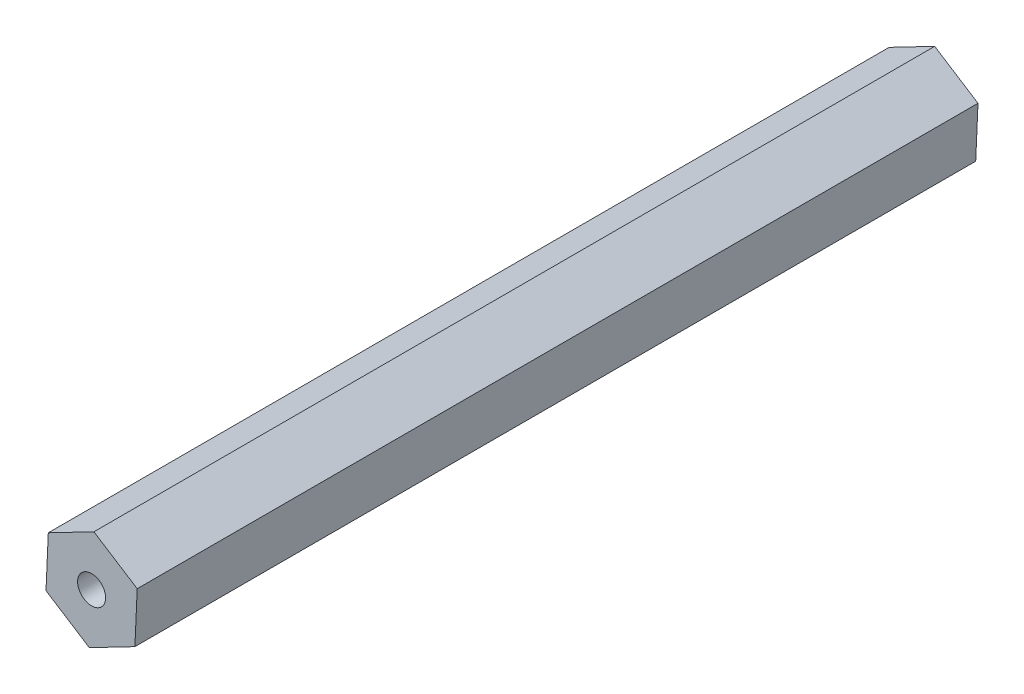
ISO-10303-21;
HEADER;
FILE_DESCRIPTION(('STEP AP214'),'2;1');
FILE_NAME('part.step','',(''),(''),'','','');
FILE_SCHEMA(('AUTOMOTIVE_DESIGN { 1 0 10303 214 1 1 1 1 }'));
ENDSEC;
DATA;
#1=APPLICATION_CONTEXT('core data for automotive mechanical design processes');
#2=APPLICATION_PROTOCOL_DEFINITION('international standard','automotive_design',2000,#1);
#3=PRODUCT_CONTEXT('',#1,'mechanical');
#4=PRODUCT('Part','Part','',(#3));
#5=PRODUCT_RELATED_PRODUCT_CATEGORY('part','',(#4));
#6=PRODUCT_DEFINITION_FORMATION('','',#4);
#7=PRODUCT_DEFINITION_CONTEXT('part definition',#1,'design');
#8=PRODUCT_DEFINITION('design','',#6,#7);
#9=PRODUCT_DEFINITION_SHAPE('','',#8);
#10=(LENGTH_UNIT() NAMED_UNIT(*) SI_UNIT(.MILLI.,.METRE.));
#11=(NAMED_UNIT(*) PLANE_ANGLE_UNIT() SI_UNIT($,.RADIAN.));
#12=(NAMED_UNIT(*) SI_UNIT($,.STERADIAN.) SOLID_ANGLE_UNIT());
#13=UNCERTAINTY_MEASURE_WITH_UNIT(LENGTH_MEASURE(1.E-05),#10,'distance_accuracy_value','');
#14=(GEOMETRIC_REPRESENTATION_CONTEXT(3) GLOBAL_UNCERTAINTY_ASSIGNED_CONTEXT((#13)) GLOBAL_UNIT_ASSIGNED_CONTEXT((#10,
#11,#12)) REPRESENTATION_CONTEXT('',''));
#15=CARTESIAN_POINT('',(0.,0.,0.));
#16=DIRECTION('',(0.,0.,1.));
#17=DIRECTION('',(1.,0.,0.));
#18=AXIS2_PLACEMENT_3D('',#15,#16,#17);
#19=CARTESIAN_POINT('',(-0.122915192994091,-2.74725169129645,45.));
#20=DIRECTION('',(-0.460792060365192,0.887508127908923,0.));
#21=DIRECTION('',(-0.887508127908923,-0.460792060365192,0.));
#22=AXIS2_PLACEMENT_3D('',#19,#20,#21);
#23=PLANE('',#22);
#24=DIRECTION('',(0.887508127908923,0.460792060365192,0.));
#25=VECTOR('',#24,1.);
#26=CARTESIAN_POINT('',(-0.122915192994091,-2.74725169129645,0.));
#27=LINE('',#26,#25);
#28=CARTESIAN_POINT('',(-0.122915192994091,-2.74725169129645,0.));
#29=VERTEX_POINT('',#28);
#30=CARTESIAN_POINT('',(2.31773215875545,-1.48007352529218,0.));
#31=VERTEX_POINT('',#30);
#32=EDGE_CURVE('E128',#29,#31,#27,.T.);
#33=ORIENTED_EDGE('',*,*,#32,.T.);
#34=DIRECTION('',(0.,0.,-1.));
#35=VECTOR('',#34,1.);
#36=CARTESIAN_POINT('',(2.31773215875545,-1.48007352529218,45.));
#37=LINE('',#36,#35);
#38=CARTESIAN_POINT('',(2.31773215875545,-1.48007352529218,45.));
#39=VERTEX_POINT('',#38);
#40=EDGE_CURVE('E11',#39,#31,#37,.T.);
#41=ORIENTED_EDGE('',*,*,#40,.F.);
#42=DIRECTION('',(0.887508127908923,0.460792060365192,0.));
#43=VECTOR('',#42,1.);
#44=CARTESIAN_POINT('',(-0.122915192994091,-2.74725169129645,45.));
#45=LINE('',#44,#43);
#46=CARTESIAN_POINT('',(-0.122915192994091,-2.74725169129645,45.));
#47=VERTEX_POINT('',#46);
#48=EDGE_CURVE('E145',#47,#39,#45,.T.);
#49=ORIENTED_EDGE('',*,*,#48,.F.);
#50=DIRECTION('',(0.,0.,-1.));
#51=VECTOR('',#50,1.);
#52=CARTESIAN_POINT('',(-0.122915192994091,-2.74725169129645,45.));
#53=LINE('',#52,#51);
#54=EDGE_CURVE('E124',#47,#29,#53,.T.);
#55=ORIENTED_EDGE('',*,*,#54,.T.);
#56=EDGE_LOOP('',(#33,#41,#49,#55));
#57=FACE_BOUND('',#56,.T.);
#58=ADVANCED_FACE('F39',(#57),#23,.F.);
#59=CARTESIAN_POINT('',(2.31773215875545,-1.48007352529218,45.));
#60=DIRECTION('',(-0.999000615016892,0.0446964338160327,0.));
#61=DIRECTION('',(-0.0446964338160327,-0.999000615016892,0.));
#62=AXIS2_PLACEMENT_3D('',#59,#60,#61);
#63=PLANE('',#62);
#64=DIRECTION('',(0.0446964338160327,0.999000615016892,0.));
#65=VECTOR('',#64,1.);
#66=CARTESIAN_POINT('',(2.31773215875545,-1.48007352529218,0.));
#67=LINE('',#66,#65);
#68=CARTESIAN_POINT('',(2.44064735174954,1.26717816600428,0.));
#69=VERTEX_POINT('',#68);
#70=EDGE_CURVE('E132',#31,#69,#67,.T.);
#71=ORIENTED_EDGE('',*,*,#70,.T.);
#72=DIRECTION('',(0.,0.,-1.));
#73=VECTOR('',#72,1.);
#74=CARTESIAN_POINT('',(2.44064735174954,1.26717816600428,45.));
#75=LINE('',#74,#73);
#76=CARTESIAN_POINT('',(2.44064735174954,1.26717816600428,45.));
#77=VERTEX_POINT('',#76);
#78=EDGE_CURVE('E48',#77,#69,#75,.T.);
#79=ORIENTED_EDGE('',*,*,#78,.F.);
#80=DIRECTION('',(0.0446964338160327,0.999000615016892,0.));
#81=VECTOR('',#80,1.);
#82=CARTESIAN_POINT('',(2.31773215875545,-1.48007352529218,45.));
#83=LINE('',#82,#81);
#84=EDGE_CURVE('E93',#39,#77,#83,.T.);
#85=ORIENTED_EDGE('',*,*,#84,.F.);
#86=ORIENTED_EDGE('',*,*,#40,.T.);
#87=EDGE_LOOP('',(#71,#79,#85,#86));
#88=FACE_BOUND('',#87,.T.);
#89=ADVANCED_FACE('F174',(#88),#63,.F.);
#90=CARTESIAN_POINT('',(2.44064735174954,1.26717816600428,45.));
#91=DIRECTION('',(-0.5382085546517,-0.84281169409289,0.));
#92=DIRECTION('',(0.84281169409289,-0.5382085546517,0.));
#93=AXIS2_PLACEMENT_3D('',#90,#91,#92);
#94=PLANE('',#93);
#95=DIRECTION('',(-0.84281169409289,0.5382085546517,0.));
#96=VECTOR('',#95,1.);
#97=CARTESIAN_POINT('',(2.44064735174954,1.26717816600428,0.));
#98=LINE('',#97,#96);
#99=CARTESIAN_POINT('',(0.12291519299409,2.74725169129645,0.));
#100=VERTEX_POINT('',#99);
#101=EDGE_CURVE('E136',#69,#100,#98,.T.);
#102=ORIENTED_EDGE('',*,*,#101,.T.);
#103=DIRECTION('',(0.,0.,-1.));
#104=VECTOR('',#103,1.);
#105=CARTESIAN_POINT('',(0.12291519299409,2.74725169129645,45.));
#106=LINE('',#105,#104);
#107=CARTESIAN_POINT('',(0.12291519299409,2.74725169129645,45.));
#108=VERTEX_POINT('',#107);
#109=EDGE_CURVE('E117',#108,#100,#106,.T.);
#110=ORIENTED_EDGE('',*,*,#109,.F.);
#111=DIRECTION('',(-0.84281169409289,0.5382085546517,0.));
#112=VECTOR('',#111,1.);
#113=CARTESIAN_POINT('',(2.44064735174954,1.26717816600428,45.));
#114=LINE('',#113,#112);
#115=EDGE_CURVE('E106',#77,#108,#114,.T.);
#116=ORIENTED_EDGE('',*,*,#115,.F.);
#117=ORIENTED_EDGE('',*,*,#78,.T.);
#118=EDGE_LOOP('',(#102,#110,#116,#117));
#119=FACE_BOUND('',#118,.T.);
#120=ADVANCED_FACE('F155',(#119),#94,.F.);
#121=CARTESIAN_POINT('',(0.12291519299409,2.74725169129645,45.));
#122=DIRECTION('',(0.460792060365192,-0.887508127908923,0.));
#123=DIRECTION('',(0.887508127908923,0.460792060365192,0.));
#124=AXIS2_PLACEMENT_3D('',#121,#122,#123);
#125=PLANE('',#124);
#126=DIRECTION('',(-0.887508127908923,-0.460792060365192,0.));
#127=VECTOR('',#126,1.);
#128=CARTESIAN_POINT('',(0.12291519299409,2.74725169129645,0.));
#129=LINE('',#128,#127);
#130=CARTESIAN_POINT('',(-2.31773215875545,1.48007352529218,0.));
#131=VERTEX_POINT('',#130);
#132=EDGE_CURVE('E115',#100,#131,#129,.T.);
#133=ORIENTED_EDGE('',*,*,#132,.T.);
#134=DIRECTION('',(0.,0.,-1.));
#135=VECTOR('',#134,1.);
#136=CARTESIAN_POINT('',(-2.31773215875545,1.48007352529218,45.));
#137=LINE('',#136,#135);
#138=CARTESIAN_POINT('',(-2.31773215875545,1.48007352529218,45.));
#139=VERTEX_POINT('',#138);
#140=EDGE_CURVE('E112',#139,#131,#137,.T.);
#141=ORIENTED_EDGE('',*,*,#140,.F.);
#142=DIRECTION('',(-0.887508127908923,-0.460792060365192,0.));
#143=VECTOR('',#142,1.);
#144=CARTESIAN_POINT('',(0.12291519299409,2.74725169129645,45.));
#145=LINE('',#144,#143);
#146=EDGE_CURVE('E100',#108,#139,#145,.T.);
#147=ORIENTED_EDGE('',*,*,#146,.F.);
#148=ORIENTED_EDGE('',*,*,#109,.T.);
#149=EDGE_LOOP('',(#133,#141,#147,#148));
#150=FACE_BOUND('',#149,.T.);
#151=ADVANCED_FACE('F113',(#150),#125,.F.);
#152=CARTESIAN_POINT('',(-2.31773215875545,1.48007352529218,45.));
#153=DIRECTION('',(0.999000615016892,-0.0446964338160325,0.));
#154=DIRECTION('',(0.0446964338160325,0.999000615016892,0.));
#155=AXIS2_PLACEMENT_3D('',#152,#153,#154);
#156=PLANE('',#155);
#157=DIRECTION('',(-0.0446964338160325,-0.999000615016892,0.));
#158=VECTOR('',#157,1.);
#159=CARTESIAN_POINT('',(-2.31773215875545,1.48007352529218,0.));
#160=LINE('',#159,#158);
#161=CARTESIAN_POINT('',(-2.44064735174954,-1.26717816600428,0.));
#162=VERTEX_POINT('',#161);
#163=EDGE_CURVE('E79',#131,#162,#160,.T.);
#164=ORIENTED_EDGE('',*,*,#163,.T.);
#165=DIRECTION('',(0.,0.,-1.));
#166=VECTOR('',#165,1.);
#167=CARTESIAN_POINT('',(-2.44064735174954,-1.26717816600428,45.));
#168=LINE('',#167,#166);
#169=CARTESIAN_POINT('',(-2.44064735174954,-1.26717816600428,45.));
#170=VERTEX_POINT('',#169);
#171=EDGE_CURVE('E118',#170,#162,#168,.T.);
#172=ORIENTED_EDGE('',*,*,#171,.F.);
#173=DIRECTION('',(-0.0446964338160325,-0.999000615016892,0.));
#174=VECTOR('',#173,1.);
#175=CARTESIAN_POINT('',(-2.31773215875545,1.48007352529218,45.));
#176=LINE('',#175,#174);
#177=EDGE_CURVE('E104',#139,#170,#176,.T.);
#178=ORIENTED_EDGE('',*,*,#177,.F.);
#179=ORIENTED_EDGE('',*,*,#140,.T.);
#180=EDGE_LOOP('',(#164,#172,#178,#179));
#181=FACE_BOUND('',#180,.T.);
#182=ADVANCED_FACE('F120',(#181),#156,.F.);
#183=CARTESIAN_POINT('',(-2.44064735174954,-1.26717816600428,45.));
#184=DIRECTION('',(0.5382085546517,0.84281169409289,0.));
#185=DIRECTION('',(-0.84281169409289,0.5382085546517,0.));
#186=AXIS2_PLACEMENT_3D('',#183,#184,#185);
#187=PLANE('',#186);
#188=DIRECTION('',(0.84281169409289,-0.5382085546517,0.));
#189=VECTOR('',#188,1.);
#190=CARTESIAN_POINT('',(-2.44064735174954,-1.26717816600428,0.));
#191=LINE('',#190,#189);
#192=EDGE_CURVE('E85',#162,#29,#191,.T.);
#193=ORIENTED_EDGE('',*,*,#192,.T.);
#194=ORIENTED_EDGE('',*,*,#54,.F.);
#195=DIRECTION('',(0.84281169409289,-0.5382085546517,0.));
#196=VECTOR('',#195,1.);
#197=CARTESIAN_POINT('',(-2.44064735174954,-1.26717816600428,45.));
#198=LINE('',#197,#196);
#199=EDGE_CURVE('E56',#170,#47,#198,.T.);
#200=ORIENTED_EDGE('',*,*,#199,.F.);
#201=ORIENTED_EDGE('',*,*,#171,.T.);
#202=EDGE_LOOP('',(#193,#194,#200,#201));
#203=FACE_BOUND('',#202,.T.);
#204=ADVANCED_FACE('F162',(#203),#187,.F.);
#205=CARTESIAN_POINT('',(0.,0.,45.));
#206=DIRECTION('',(0.,0.,1.));
#207=DIRECTION('',(1.,0.,0.));
#208=AXIS2_PLACEMENT_3D('',#205,#206,#207);
#209=PLANE('',#208);
#210=CARTESIAN_POINT('',(0.,0.,45.));
#211=DIRECTION('',(0.,0.,1.));
#212=DIRECTION('',(1.,0.,0.));
#213=AXIS2_PLACEMENT_3D('',#210,#211,#212);
#214=CIRCLE('',#213,0.75);
#215=CARTESIAN_POINT('',(0.75,0.,45.));
#216=VERTEX_POINT('',#215);
#217=EDGE_CURVE('E258',#216,#216,#214,.T.);
#218=ORIENTED_EDGE('',*,*,#217,.F.);
#219=EDGE_LOOP('',(#218));
#220=FACE_BOUND('',#219,.T.);
#221=ORIENTED_EDGE('',*,*,#48,.T.);
#222=ORIENTED_EDGE('',*,*,#84,.T.);
#223=ORIENTED_EDGE('',*,*,#115,.T.);
#224=ORIENTED_EDGE('',*,*,#146,.T.);
#225=ORIENTED_EDGE('',*,*,#177,.T.);
#226=ORIENTED_EDGE('',*,*,#199,.T.);
#227=EDGE_LOOP('',(#221,#222,#223,#224,#225,#226));
#228=FACE_BOUND('',#227,.T.);
#229=ADVANCED_FACE('F102',(#220,#228),#209,.T.);
#230=CARTESIAN_POINT('',(0.,0.,0.));
#231=DIRECTION('',(0.,0.,1.));
#232=DIRECTION('',(1.,0.,0.));
#233=AXIS2_PLACEMENT_3D('',#230,#231,#232);
#234=PLANE('',#233);
#235=CARTESIAN_POINT('',(0.,0.,0.));
#236=DIRECTION('',(0.,0.,-1.));
#237=DIRECTION('',(-1.,0.,0.));
#238=AXIS2_PLACEMENT_3D('',#235,#236,#237);
#239=CIRCLE('',#238,0.75);
#240=CARTESIAN_POINT('',(-0.75,0.,0.));
#241=VERTEX_POINT('',#240);
#242=EDGE_CURVE('E259',#241,#241,#239,.T.);
#243=ORIENTED_EDGE('',*,*,#242,.F.);
#244=EDGE_LOOP('',(#243));
#245=FACE_BOUND('',#244,.T.);
#246=ORIENTED_EDGE('',*,*,#32,.F.);
#247=ORIENTED_EDGE('',*,*,#192,.F.);
#248=ORIENTED_EDGE('',*,*,#163,.F.);
#249=ORIENTED_EDGE('',*,*,#132,.F.);
#250=ORIENTED_EDGE('',*,*,#101,.F.);
#251=ORIENTED_EDGE('',*,*,#70,.F.);
#252=EDGE_LOOP('',(#246,#247,#248,#249,#250,#251));
#253=FACE_BOUND('',#252,.T.);
#254=ADVANCED_FACE('F158',(#245,#253),#234,.F.);
#255=CARTESIAN_POINT('',(0.,0.,40.));
#256=DIRECTION('',(0.,0.,1.));
#257=DIRECTION('',(1.,0.,0.));
#258=AXIS2_PLACEMENT_3D('',#255,#256,#257);
#259=CYLINDRICAL_SURFACE('',#258,0.75);
#260=CARTESIAN_POINT('',(0.,0.,40.));
#261=DIRECTION('',(0.,0.,1.));
#262=DIRECTION('',(1.,0.,0.));
#263=AXIS2_PLACEMENT_3D('',#260,#261,#262);
#264=CIRCLE('',#263,0.75);
#265=CARTESIAN_POINT('',(0.75,0.,40.));
#266=VERTEX_POINT('',#265);
#267=EDGE_CURVE('E133',#266,#266,#264,.T.);
#268=ORIENTED_EDGE('',*,*,#267,.F.);
#269=EDGE_LOOP('',(#268));
#270=FACE_BOUND('',#269,.T.);
#271=ORIENTED_EDGE('',*,*,#217,.T.);
#272=EDGE_LOOP('',(#271));
#273=FACE_BOUND('',#272,.T.);
#274=ADVANCED_FACE('F209',(#270,#273),#259,.F.);
#275=CARTESIAN_POINT('',(0.,0.,40.));
#276=DIRECTION('',(0.,0.,1.));
#277=DIRECTION('',(1.,0.,0.));
#278=AXIS2_PLACEMENT_3D('',#275,#276,#277);
#279=PLANE('',#278);
#280=ORIENTED_EDGE('',*,*,#267,.T.);
#281=EDGE_LOOP('',(#280));
#282=FACE_BOUND('',#281,.T.);
#283=ADVANCED_FACE('F214',(#282),#279,.T.);
#284=CARTESIAN_POINT('',(0.,0.,5.));
#285=DIRECTION('',(0.,0.,-1.));
#286=DIRECTION('',(-1.,0.,0.));
#287=AXIS2_PLACEMENT_3D('',#284,#285,#286);
#288=CYLINDRICAL_SURFACE('',#287,0.75);
#289=CARTESIAN_POINT('',(0.,0.,5.));
#290=DIRECTION('',(0.,0.,-1.));
#291=DIRECTION('',(-1.,0.,0.));
#292=AXIS2_PLACEMENT_3D('',#289,#290,#291);
#293=CIRCLE('',#292,0.75);
#294=CARTESIAN_POINT('',(-0.75,0.,5.));
#295=VERTEX_POINT('',#294);
#296=EDGE_CURVE('E256',#295,#295,#293,.T.);
#297=ORIENTED_EDGE('',*,*,#296,.F.);
#298=EDGE_LOOP('',(#297));
#299=FACE_BOUND('',#298,.T.);
#300=ORIENTED_EDGE('',*,*,#242,.T.);
#301=EDGE_LOOP('',(#300));
#302=FACE_BOUND('',#301,.T.);
#303=ADVANCED_FACE('F224',(#299,#302),#288,.F.);
#304=CARTESIAN_POINT('',(0.,0.,5.));
#305=DIRECTION('',(0.,0.,-1.));
#306=DIRECTION('',(-1.,0.,0.));
#307=AXIS2_PLACEMENT_3D('',#304,#305,#306);
#308=PLANE('',#307);
#309=ORIENTED_EDGE('',*,*,#296,.T.);
#310=EDGE_LOOP('',(#309));
#311=FACE_BOUND('',#310,.T.);
#312=ADVANCED_FACE('F240',(#311),#308,.T.);
#313=CLOSED_SHELL('',(#58,#89,#120,#151,#182,#204,#229,#254,#274,#283,#303,#312));
#314=MANIFOLD_SOLID_BREP('B2',#313);
#315=ADVANCED_BREP_SHAPE_REPRESENTATION('',(#18,#314),#14);
#316=SHAPE_DEFINITION_REPRESENTATION(#9,#315);
ENDSEC;
END-ISO-10303-21;
